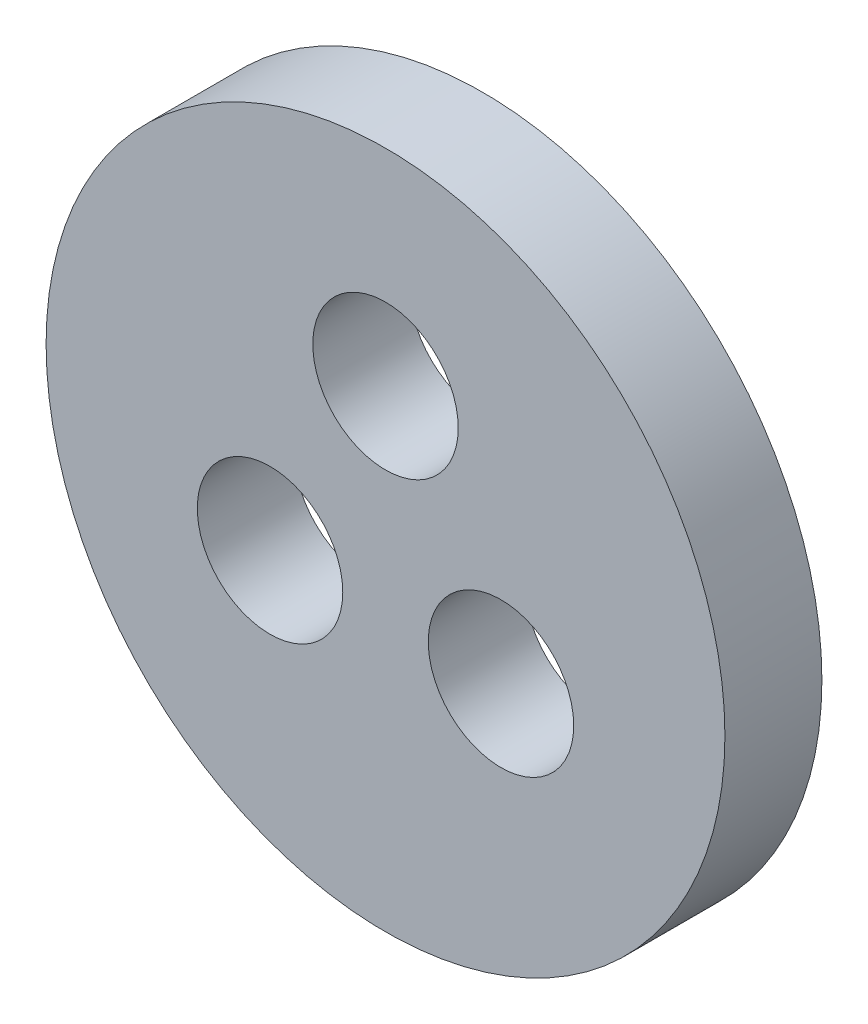
ISO-10303-21;
HEADER;
FILE_DESCRIPTION(('STEP AP214'),'2;1');
FILE_NAME('part.step','',(''),(''),'','','');
FILE_SCHEMA(('AUTOMOTIVE_DESIGN { 1 0 10303 214 1 1 1 1 }'));
ENDSEC;
DATA;
#1=APPLICATION_CONTEXT('core data for automotive mechanical design processes');
#2=APPLICATION_PROTOCOL_DEFINITION('international standard','automotive_design',2000,#1);
#3=PRODUCT_CONTEXT('',#1,'mechanical');
#4=PRODUCT('Part','Part','',(#3));
#5=PRODUCT_RELATED_PRODUCT_CATEGORY('part','',(#4));
#6=PRODUCT_DEFINITION_FORMATION('','',#4);
#7=PRODUCT_DEFINITION_CONTEXT('part definition',#1,'design');
#8=PRODUCT_DEFINITION('design','',#6,#7);
#9=PRODUCT_DEFINITION_SHAPE('','',#8);
#10=(LENGTH_UNIT() NAMED_UNIT(*) SI_UNIT(.MILLI.,.METRE.));
#11=(NAMED_UNIT(*) PLANE_ANGLE_UNIT() SI_UNIT($,.RADIAN.));
#12=(NAMED_UNIT(*) SI_UNIT($,.STERADIAN.) SOLID_ANGLE_UNIT());
#13=UNCERTAINTY_MEASURE_WITH_UNIT(LENGTH_MEASURE(1.E-05),#10,'distance_accuracy_value','');
#14=(GEOMETRIC_REPRESENTATION_CONTEXT(3) GLOBAL_UNCERTAINTY_ASSIGNED_CONTEXT((#13)) GLOBAL_UNIT_ASSIGNED_CONTEXT((#10,
#11,#12)) REPRESENTATION_CONTEXT('',''));
#15=CARTESIAN_POINT('',(0.,0.,0.));
#16=DIRECTION('',(0.,0.,1.));
#17=DIRECTION('',(1.,0.,0.));
#18=AXIS2_PLACEMENT_3D('',#15,#16,#17);
#19=CARTESIAN_POINT('',(0.,0.,3.175));
#20=DIRECTION('',(0.,0.,1.));
#21=DIRECTION('',(1.,0.,0.));
#22=AXIS2_PLACEMENT_3D('',#19,#20,#21);
#23=PLANE('',#22);
#24=CARTESIAN_POINT('',(3.78074215339672,-2.18281249999984,3.175));
#25=DIRECTION('',(0.,0.,1.));
#26=DIRECTION('',(1.,0.,0.));
#27=AXIS2_PLACEMENT_3D('',#24,#25,#26);
#28=CIRCLE('',#27,2.38125000000024);
#29=CARTESIAN_POINT('',(6.16199215339696,-2.18281249999984,3.175));
#30=VERTEX_POINT('',#29);
#31=EDGE_CURVE('E47',#30,#30,#28,.T.);
#32=ORIENTED_EDGE('',*,*,#31,.F.);
#33=EDGE_LOOP('',(#32));
#34=FACE_BOUND('',#33,.T.);
#35=CARTESIAN_POINT('',(0.,0.,3.175));
#36=DIRECTION('',(0.,0.,1.));
#37=DIRECTION('',(1.,0.,0.));
#38=AXIS2_PLACEMENT_3D('',#35,#36,#37);
#39=CIRCLE('',#38,11.1125);
#40=CARTESIAN_POINT('',(11.1125,0.,3.175));
#41=VERTEX_POINT('',#40);
#42=EDGE_CURVE('E10',#41,#41,#39,.T.);
#43=ORIENTED_EDGE('',*,*,#42,.T.);
#44=EDGE_LOOP('',(#43));
#45=FACE_BOUND('',#44,.T.);
#46=CARTESIAN_POINT('',(0.,4.365625,3.175));
#47=DIRECTION('',(0.,0.,1.));
#48=DIRECTION('',(1.,0.,0.));
#49=AXIS2_PLACEMENT_3D('',#46,#47,#48);
#50=CIRCLE('',#49,2.38125);
#51=CARTESIAN_POINT('',(2.38125,4.365625,3.175));
#52=VERTEX_POINT('',#51);
#53=EDGE_CURVE('E42',#52,#52,#50,.T.);
#54=ORIENTED_EDGE('',*,*,#53,.F.);
#55=EDGE_LOOP('',(#54));
#56=FACE_BOUND('',#55,.T.);
#57=CARTESIAN_POINT('',(-3.78074215339616,-2.18281250000016,3.175));
#58=DIRECTION('',(0.,0.,1.));
#59=DIRECTION('',(1.,0.,0.));
#60=AXIS2_PLACEMENT_3D('',#57,#58,#59);
#61=CIRCLE('',#60,2.38125000000035);
#62=CARTESIAN_POINT('',(-1.39949215339581,-2.18281250000016,3.175));
#63=VERTEX_POINT('',#62);
#64=EDGE_CURVE('E53',#63,#63,#61,.T.);
#65=ORIENTED_EDGE('',*,*,#64,.F.);
#66=EDGE_LOOP('',(#65));
#67=FACE_BOUND('',#66,.T.);
#68=ADVANCED_FACE('F31',(#34,#45,#56,#67),#23,.T.);
#69=CARTESIAN_POINT('',(0.,0.,0.));
#70=DIRECTION('',(0.,0.,1.));
#71=DIRECTION('',(1.,0.,0.));
#72=AXIS2_PLACEMENT_3D('',#69,#70,#71);
#73=PLANE('',#72);
#74=CARTESIAN_POINT('',(0.,0.,0.));
#75=DIRECTION('',(0.,0.,1.));
#76=DIRECTION('',(1.,0.,0.));
#77=AXIS2_PLACEMENT_3D('',#74,#75,#76);
#78=CIRCLE('',#77,11.1125);
#79=CARTESIAN_POINT('',(11.1125,0.,0.));
#80=VERTEX_POINT('',#79);
#81=EDGE_CURVE('E35',#80,#80,#78,.T.);
#82=ORIENTED_EDGE('',*,*,#81,.F.);
#83=EDGE_LOOP('',(#82));
#84=FACE_BOUND('',#83,.T.);
#85=CARTESIAN_POINT('',(0.,4.365625,0.));
#86=DIRECTION('',(0.,0.,1.));
#87=DIRECTION('',(1.,0.,0.));
#88=AXIS2_PLACEMENT_3D('',#85,#86,#87);
#89=CIRCLE('',#88,2.38125);
#90=CARTESIAN_POINT('',(2.38125,4.365625,0.));
#91=VERTEX_POINT('',#90);
#92=EDGE_CURVE('E44',#91,#91,#89,.T.);
#93=ORIENTED_EDGE('',*,*,#92,.T.);
#94=EDGE_LOOP('',(#93));
#95=FACE_BOUND('',#94,.T.);
#96=CARTESIAN_POINT('',(3.78074215339672,-2.18281249999984,0.));
#97=DIRECTION('',(0.,0.,1.));
#98=DIRECTION('',(1.,0.,0.));
#99=AXIS2_PLACEMENT_3D('',#96,#97,#98);
#100=CIRCLE('',#99,2.38125000000024);
#101=CARTESIAN_POINT('',(6.16199215339696,-2.18281249999984,0.));
#102=VERTEX_POINT('',#101);
#103=EDGE_CURVE('E50',#102,#102,#100,.T.);
#104=ORIENTED_EDGE('',*,*,#103,.T.);
#105=EDGE_LOOP('',(#104));
#106=FACE_BOUND('',#105,.T.);
#107=CARTESIAN_POINT('',(-3.78074215339616,-2.18281250000016,0.));
#108=DIRECTION('',(0.,0.,1.));
#109=DIRECTION('',(1.,0.,0.));
#110=AXIS2_PLACEMENT_3D('',#107,#108,#109);
#111=CIRCLE('',#110,2.38125000000035);
#112=CARTESIAN_POINT('',(-1.39949215339581,-2.18281250000016,0.));
#113=VERTEX_POINT('',#112);
#114=EDGE_CURVE('E56',#113,#113,#111,.T.);
#115=ORIENTED_EDGE('',*,*,#114,.T.);
#116=EDGE_LOOP('',(#115));
#117=FACE_BOUND('',#116,.T.);
#118=ADVANCED_FACE('F66',(#84,#95,#106,#117),#73,.F.);
#119=CARTESIAN_POINT('',(0.,0.,3.175));
#120=DIRECTION('',(0.,0.,-1.));
#121=DIRECTION('',(-1.,0.,0.));
#122=AXIS2_PLACEMENT_3D('',#119,#120,#121);
#123=CYLINDRICAL_SURFACE('',#122,11.1125);
#124=ORIENTED_EDGE('',*,*,#42,.F.);
#125=EDGE_LOOP('',(#124));
#126=FACE_BOUND('',#125,.T.);
#127=ORIENTED_EDGE('',*,*,#81,.T.);
#128=EDGE_LOOP('',(#127));
#129=FACE_BOUND('',#128,.T.);
#130=ADVANCED_FACE('F33',(#126,#129),#123,.T.);
#131=CARTESIAN_POINT('',(0.,4.365625,3.175));
#132=DIRECTION('',(0.,0.,-1.));
#133=DIRECTION('',(-1.,0.,0.));
#134=AXIS2_PLACEMENT_3D('',#131,#132,#133);
#135=CYLINDRICAL_SURFACE('',#134,2.38125);
#136=ORIENTED_EDGE('',*,*,#53,.T.);
#137=EDGE_LOOP('',(#136));
#138=FACE_BOUND('',#137,.T.);
#139=ORIENTED_EDGE('',*,*,#92,.F.);
#140=EDGE_LOOP('',(#139));
#141=FACE_BOUND('',#140,.T.);
#142=ADVANCED_FACE('F75',(#138,#141),#135,.F.);
#143=CARTESIAN_POINT('',(3.78074215339672,-2.18281249999984,3.175));
#144=DIRECTION('',(0.,0.,-1.));
#145=DIRECTION('',(-1.,0.,0.));
#146=AXIS2_PLACEMENT_3D('',#143,#144,#145);
#147=CYLINDRICAL_SURFACE('',#146,2.38125000000024);
#148=ORIENTED_EDGE('',*,*,#31,.T.);
#149=EDGE_LOOP('',(#148));
#150=FACE_BOUND('',#149,.T.);
#151=ORIENTED_EDGE('',*,*,#103,.F.);
#152=EDGE_LOOP('',(#151));
#153=FACE_BOUND('',#152,.T.);
#154=ADVANCED_FACE('F78',(#150,#153),#147,.F.);
#155=CARTESIAN_POINT('',(-3.78074215339616,-2.18281250000016,3.175));
#156=DIRECTION('',(0.,0.,-1.));
#157=DIRECTION('',(-1.,0.,0.));
#158=AXIS2_PLACEMENT_3D('',#155,#156,#157);
#159=CYLINDRICAL_SURFACE('',#158,2.38125000000035);
#160=ORIENTED_EDGE('',*,*,#64,.T.);
#161=EDGE_LOOP('',(#160));
#162=FACE_BOUND('',#161,.T.);
#163=ORIENTED_EDGE('',*,*,#114,.F.);
#164=EDGE_LOOP('',(#163));
#165=FACE_BOUND('',#164,.T.);
#166=ADVANCED_FACE('F62',(#162,#165),#159,.F.);
#167=CLOSED_SHELL('',(#68,#118,#130,#142,#154,#166));
#168=MANIFOLD_SOLID_BREP('B2',#167);
#169=ADVANCED_BREP_SHAPE_REPRESENTATION('',(#18,#168),#14);
#170=SHAPE_DEFINITION_REPRESENTATION(#9,#169);
ENDSEC;
END-ISO-10303-21;
